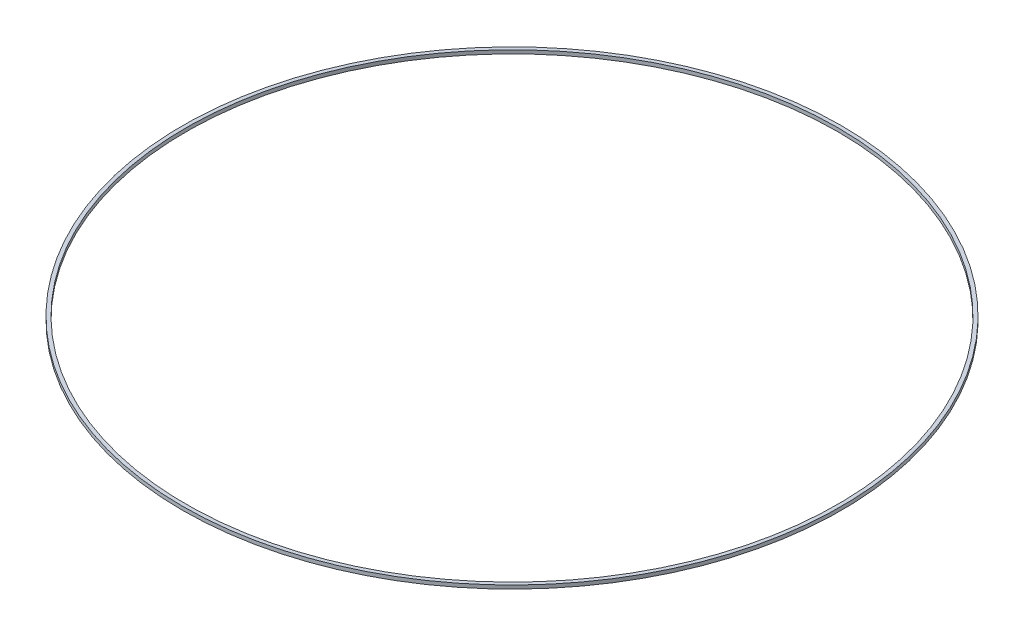
ISO-10303-21;
HEADER;
FILE_DESCRIPTION(('STEP AP214'),'2;1');
FILE_NAME('part.step','',(''),(''),'','','');
FILE_SCHEMA(('AUTOMOTIVE_DESIGN { 1 0 10303 214 1 1 1 1 }'));
ENDSEC;
DATA;
#1=APPLICATION_CONTEXT('core data for automotive mechanical design processes');
#2=APPLICATION_PROTOCOL_DEFINITION('international standard','automotive_design',2000,#1);
#3=PRODUCT_CONTEXT('',#1,'mechanical');
#4=PRODUCT('Part','Part','',(#3));
#5=PRODUCT_RELATED_PRODUCT_CATEGORY('part','',(#4));
#6=PRODUCT_DEFINITION_FORMATION('','',#4);
#7=PRODUCT_DEFINITION_CONTEXT('part definition',#1,'design');
#8=PRODUCT_DEFINITION('design','',#6,#7);
#9=PRODUCT_DEFINITION_SHAPE('','',#8);
#10=(LENGTH_UNIT() NAMED_UNIT(*) SI_UNIT(.MILLI.,.METRE.));
#11=(NAMED_UNIT(*) PLANE_ANGLE_UNIT() SI_UNIT($,.RADIAN.));
#12=(NAMED_UNIT(*) SI_UNIT($,.STERADIAN.) SOLID_ANGLE_UNIT());
#13=UNCERTAINTY_MEASURE_WITH_UNIT(LENGTH_MEASURE(1.E-05),#10,'distance_accuracy_value','');
#14=(GEOMETRIC_REPRESENTATION_CONTEXT(3) GLOBAL_UNCERTAINTY_ASSIGNED_CONTEXT((#13)) GLOBAL_UNIT_ASSIGNED_CONTEXT((#10,
#11,#12)) REPRESENTATION_CONTEXT('',''));
#15=CARTESIAN_POINT('',(0.,0.,0.));
#16=DIRECTION('',(0.,0.,1.));
#17=DIRECTION('',(1.,0.,0.));
#18=AXIS2_PLACEMENT_3D('',#15,#16,#17);
#19=CARTESIAN_POINT('',(0.,0.,0.));
#20=DIRECTION('',(0.,-1.,0.));
#21=DIRECTION('',(0.,0.,-1.));
#22=AXIS2_PLACEMENT_3D('',#19,#20,#21);
#23=CYLINDRICAL_SURFACE('',#22,194.168576521518);
#24=CARTESIAN_POINT('',(0.,2.12132034355964,0.));
#25=DIRECTION('',(0.,-1.,0.));
#26=DIRECTION('',(0.,0.,-1.));
#27=AXIS2_PLACEMENT_3D('',#24,#25,#26);
#28=CIRCLE('',#27,194.168576521518);
#29=CARTESIAN_POINT('',(0.,2.12132034355964,-194.168576521518));
#30=VERTEX_POINT('',#29);
#31=EDGE_CURVE('E49',#30,#30,#28,.T.);
#32=ORIENTED_EDGE('',*,*,#31,.F.);
#33=EDGE_LOOP('',(#32));
#34=FACE_BOUND('',#33,.T.);
#35=CARTESIAN_POINT('',(0.,0.,0.));
#36=DIRECTION('',(0.,-1.,0.));
#37=DIRECTION('',(0.,0.,-1.));
#38=AXIS2_PLACEMENT_3D('',#35,#36,#37);
#39=CIRCLE('',#38,194.168576521518);
#40=CARTESIAN_POINT('',(0.,0.,-194.168576521518));
#41=VERTEX_POINT('',#40);
#42=EDGE_CURVE('E10',#41,#41,#39,.T.);
#43=ORIENTED_EDGE('',*,*,#42,.T.);
#44=EDGE_LOOP('',(#43));
#45=FACE_BOUND('',#44,.T.);
#46=ADVANCED_FACE('F35',(#34,#45),#23,.F.);
#47=CARTESIAN_POINT('',(-194.168576521518,0.,0.));
#48=DIRECTION('',(0.,1.,0.));
#49=DIRECTION('',(0.,0.,1.));
#50=AXIS2_PLACEMENT_3D('',#47,#48,#49);
#51=PLANE('',#50);
#52=ORIENTED_EDGE('',*,*,#42,.F.);
#53=EDGE_LOOP('',(#52));
#54=FACE_BOUND('',#53,.T.);
#55=CARTESIAN_POINT('',(0.,0.,0.));
#56=DIRECTION('',(0.,-1.,0.));
#57=DIRECTION('',(0.,0.,-1.));
#58=AXIS2_PLACEMENT_3D('',#55,#56,#57);
#59=CIRCLE('',#58,196.289896865077);
#60=CARTESIAN_POINT('',(0.,0.,-196.289896865077));
#61=VERTEX_POINT('',#60);
#62=EDGE_CURVE('E41',#61,#61,#59,.T.);
#63=ORIENTED_EDGE('',*,*,#62,.T.);
#64=EDGE_LOOP('',(#63));
#65=FACE_BOUND('',#64,.T.);
#66=ADVANCED_FACE('F58',(#54,#65),#51,.F.);
#67=CARTESIAN_POINT('',(0.,0.,0.));
#68=DIRECTION('',(0.,-1.,0.));
#69=DIRECTION('',(0.,0.,-1.));
#70=AXIS2_PLACEMENT_3D('',#67,#68,#69);
#71=CYLINDRICAL_SURFACE('',#70,196.289896865077);
#72=ORIENTED_EDGE('',*,*,#62,.F.);
#73=EDGE_LOOP('',(#72));
#74=FACE_BOUND('',#73,.T.);
#75=CARTESIAN_POINT('',(0.,2.12132034355964,0.));
#76=DIRECTION('',(0.,-1.,0.));
#77=DIRECTION('',(0.,0.,-1.));
#78=AXIS2_PLACEMENT_3D('',#75,#76,#77);
#79=CIRCLE('',#78,196.289896865077);
#80=CARTESIAN_POINT('',(0.,2.12132034355964,-196.289896865077));
#81=VERTEX_POINT('',#80);
#82=EDGE_CURVE('E45',#81,#81,#79,.T.);
#83=ORIENTED_EDGE('',*,*,#82,.T.);
#84=EDGE_LOOP('',(#83));
#85=FACE_BOUND('',#84,.T.);
#86=ADVANCED_FACE('F62',(#74,#85),#71,.T.);
#87=CARTESIAN_POINT('',(-196.289896865077,2.12132034355964,0.));
#88=DIRECTION('',(0.,-1.,0.));
#89=DIRECTION('',(0.,0.,-1.));
#90=AXIS2_PLACEMENT_3D('',#87,#88,#89);
#91=PLANE('',#90);
#92=ORIENTED_EDGE('',*,*,#82,.F.);
#93=EDGE_LOOP('',(#92));
#94=FACE_BOUND('',#93,.T.);
#95=ORIENTED_EDGE('',*,*,#31,.T.);
#96=EDGE_LOOP('',(#95));
#97=FACE_BOUND('',#96,.T.);
#98=ADVANCED_FACE('F55',(#94,#97),#91,.F.);
#99=CLOSED_SHELL('',(#46,#66,#86,#98));
#100=MANIFOLD_SOLID_BREP('B2',#99);
#101=ADVANCED_BREP_SHAPE_REPRESENTATION('',(#18,#100),#14);
#102=SHAPE_DEFINITION_REPRESENTATION(#9,#101);
ENDSEC;
END-ISO-10303-21;
